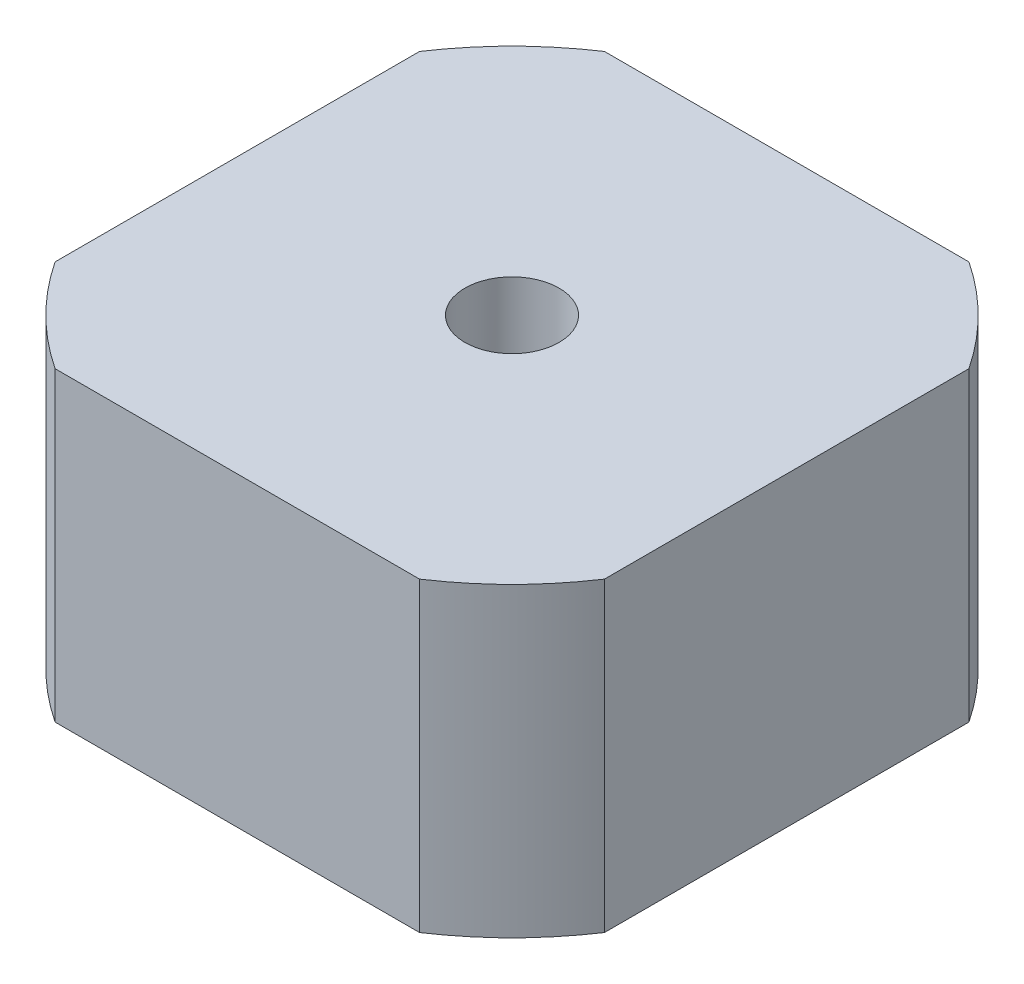
ISO-10303-21;
HEADER;
FILE_DESCRIPTION(('STEP AP214'),'2;1');
FILE_NAME('part.step','',(''),(''),'','','');
FILE_SCHEMA(('AUTOMOTIVE_DESIGN { 1 0 10303 214 1 1 1 1 }'));
ENDSEC;
DATA;
#1=APPLICATION_CONTEXT('core data for automotive mechanical design processes');
#2=APPLICATION_PROTOCOL_DEFINITION('international standard','automotive_design',2000,#1);
#3=PRODUCT_CONTEXT('',#1,'mechanical');
#4=PRODUCT('Part','Part','',(#3));
#5=PRODUCT_RELATED_PRODUCT_CATEGORY('part','',(#4));
#6=PRODUCT_DEFINITION_FORMATION('','',#4);
#7=PRODUCT_DEFINITION_CONTEXT('part definition',#1,'design');
#8=PRODUCT_DEFINITION('design','',#6,#7);
#9=PRODUCT_DEFINITION_SHAPE('','',#8);
#10=(LENGTH_UNIT() NAMED_UNIT(*) SI_UNIT(.MILLI.,.METRE.));
#11=(NAMED_UNIT(*) PLANE_ANGLE_UNIT() SI_UNIT($,.RADIAN.));
#12=(NAMED_UNIT(*) SI_UNIT($,.STERADIAN.) SOLID_ANGLE_UNIT());
#13=UNCERTAINTY_MEASURE_WITH_UNIT(LENGTH_MEASURE(1.E-05),#10,'distance_accuracy_value','');
#14=(GEOMETRIC_REPRESENTATION_CONTEXT(3) GLOBAL_UNCERTAINTY_ASSIGNED_CONTEXT((#13)) GLOBAL_UNIT_ASSIGNED_CONTEXT((#10,
#11,#12)) REPRESENTATION_CONTEXT('',''));
#15=CARTESIAN_POINT('',(0.,0.,0.));
#16=DIRECTION('',(0.,0.,1.));
#17=DIRECTION('',(1.,0.,0.));
#18=AXIS2_PLACEMENT_3D('',#15,#16,#17);
#19=CARTESIAN_POINT('',(0.,0.,0.));
#20=DIRECTION('',(0.,1.,0.));
#21=DIRECTION('',(1.,0.,0.));
#22=AXIS2_PLACEMENT_3D('',#19,#20,#21);
#23=PLANE('',#22);
#24=DIRECTION('',(0.,0.,1.));
#25=VECTOR('',#24,1.);
#26=CARTESIAN_POINT('',(-17.5,0.,-11.60818676624));
#27=LINE('',#26,#25);
#28=CARTESIAN_POINT('',(-17.5,0.,-11.60818676624));
#29=VERTEX_POINT('',#28);
#30=CARTESIAN_POINT('',(-17.5,0.,11.60818676624));
#31=VERTEX_POINT('',#30);
#32=EDGE_CURVE('E105',#29,#31,#27,.T.);
#33=ORIENTED_EDGE('',*,*,#32,.F.);
#34=CARTESIAN_POINT('',(0.,0.,0.));
#35=DIRECTION('',(0.,1.,0.));
#36=DIRECTION('',(-0.552770798392605,0.,-0.833333333333308));
#37=AXIS2_PLACEMENT_3D('',#34,#35,#36);
#38=CIRCLE('',#37,21.);
#39=CARTESIAN_POINT('',(-11.60818676624,0.,-17.5));
#40=VERTEX_POINT('',#39);
#41=EDGE_CURVE('E36',#40,#29,#38,.T.);
#42=ORIENTED_EDGE('',*,*,#41,.F.);
#43=DIRECTION('',(-1.,0.,0.));
#44=VECTOR('',#43,1.);
#45=CARTESIAN_POINT('',(11.60818676624,0.,-17.5));
#46=LINE('',#45,#44);
#47=CARTESIAN_POINT('',(11.60818676624,0.,-17.5));
#48=VERTEX_POINT('',#47);
#49=EDGE_CURVE('E128',#48,#40,#46,.T.);
#50=ORIENTED_EDGE('',*,*,#49,.F.);
#51=CARTESIAN_POINT('',(0.,0.,0.));
#52=DIRECTION('',(0.,1.,0.));
#53=DIRECTION('',(0.833333333333308,0.,-0.552770798392605));
#54=AXIS2_PLACEMENT_3D('',#51,#52,#53);
#55=CIRCLE('',#54,21.);
#56=CARTESIAN_POINT('',(17.5,0.,-11.60818676624));
#57=VERTEX_POINT('',#56);
#58=EDGE_CURVE('E112',#57,#48,#55,.T.);
#59=ORIENTED_EDGE('',*,*,#58,.F.);
#60=DIRECTION('',(0.,0.,-1.));
#61=VECTOR('',#60,1.);
#62=CARTESIAN_POINT('',(17.5,0.,11.60818676624));
#63=LINE('',#62,#61);
#64=CARTESIAN_POINT('',(17.5,0.,11.60818676624));
#65=VERTEX_POINT('',#64);
#66=EDGE_CURVE('E127',#65,#57,#63,.T.);
#67=ORIENTED_EDGE('',*,*,#66,.F.);
#68=CARTESIAN_POINT('',(0.,0.,0.));
#69=DIRECTION('',(0.,1.,0.));
#70=DIRECTION('',(0.552770798392605,0.,0.833333333333308));
#71=AXIS2_PLACEMENT_3D('',#68,#69,#70);
#72=CIRCLE('',#71,21.);
#73=CARTESIAN_POINT('',(11.60818676624,0.,17.5));
#74=VERTEX_POINT('',#73);
#75=EDGE_CURVE('E109',#74,#65,#72,.T.);
#76=ORIENTED_EDGE('',*,*,#75,.F.);
#77=DIRECTION('',(1.,0.,0.));
#78=VECTOR('',#77,1.);
#79=CARTESIAN_POINT('',(-11.60818676624,0.,17.5));
#80=LINE('',#79,#78);
#81=CARTESIAN_POINT('',(-11.60818676624,0.,17.5));
#82=VERTEX_POINT('',#81);
#83=EDGE_CURVE('E123',#82,#74,#80,.T.);
#84=ORIENTED_EDGE('',*,*,#83,.F.);
#85=CARTESIAN_POINT('',(0.,0.,0.));
#86=DIRECTION('',(0.,1.,0.));
#87=DIRECTION('',(-0.833333333333308,0.,0.552770798392605));
#88=AXIS2_PLACEMENT_3D('',#85,#86,#87);
#89=CIRCLE('',#88,21.);
#90=EDGE_CURVE('E119',#31,#82,#89,.T.);
#91=ORIENTED_EDGE('',*,*,#90,.F.);
#92=EDGE_LOOP('',(#33,#42,#50,#59,#67,#76,#84,#91));
#93=FACE_BOUND('',#92,.T.);
#94=CARTESIAN_POINT('',(0.,0.,0.));
#95=DIRECTION('',(0.,-1.,0.));
#96=DIRECTION('',(-1.,0.,0.));
#97=AXIS2_PLACEMENT_3D('',#94,#95,#96);
#98=CIRCLE('',#97,3.);
#99=CARTESIAN_POINT('',(-3.,0.,0.));
#100=VERTEX_POINT('',#99);
#101=EDGE_CURVE('E11',#100,#100,#98,.T.);
#102=ORIENTED_EDGE('',*,*,#101,.F.);
#103=EDGE_LOOP('',(#102));
#104=FACE_BOUND('',#103,.T.);
#105=ADVANCED_FACE('F17',(#93,#104),#23,.F.);
#106=CARTESIAN_POINT('',(0.,0.,0.));
#107=DIRECTION('',(0.,1.,0.));
#108=DIRECTION('',(1.,0.,0.));
#109=AXIS2_PLACEMENT_3D('',#106,#107,#108);
#110=CYLINDRICAL_SURFACE('',#109,3.);
#111=CARTESIAN_POINT('',(0.,19.5,0.));
#112=DIRECTION('',(0.,-1.,0.));
#113=DIRECTION('',(1.,0.,0.));
#114=AXIS2_PLACEMENT_3D('',#111,#112,#113);
#115=CIRCLE('',#114,3.);
#116=CARTESIAN_POINT('',(3.,19.5,0.));
#117=VERTEX_POINT('',#116);
#118=EDGE_CURVE('E97',#117,#117,#115,.T.);
#119=ORIENTED_EDGE('',*,*,#118,.F.);
#120=EDGE_LOOP('',(#119));
#121=FACE_BOUND('',#120,.T.);
#122=ORIENTED_EDGE('',*,*,#101,.T.);
#123=EDGE_LOOP('',(#122));
#124=FACE_BOUND('',#123,.T.);
#125=ADVANCED_FACE('F173',(#121,#124),#110,.F.);
#126=CARTESIAN_POINT('',(0.,19.5,0.));
#127=DIRECTION('',(0.,1.,0.));
#128=DIRECTION('',(1.,0.,0.));
#129=AXIS2_PLACEMENT_3D('',#126,#127,#128);
#130=PLANE('',#129);
#131=DIRECTION('',(1.,0.,0.));
#132=VECTOR('',#131,1.);
#133=CARTESIAN_POINT('',(-11.60818676624,19.5,17.5));
#134=LINE('',#133,#132);
#135=CARTESIAN_POINT('',(-11.60818676624,19.5,17.5));
#136=VERTEX_POINT('',#135);
#137=CARTESIAN_POINT('',(11.60818676624,19.5,17.5));
#138=VERTEX_POINT('',#137);
#139=EDGE_CURVE('E27',#136,#138,#134,.T.);
#140=ORIENTED_EDGE('',*,*,#139,.T.);
#141=CARTESIAN_POINT('',(0.,19.5,0.));
#142=DIRECTION('',(0.,1.,0.));
#143=DIRECTION('',(0.552770798392605,0.,0.833333333333308));
#144=AXIS2_PLACEMENT_3D('',#141,#142,#143);
#145=CIRCLE('',#144,21.);
#146=CARTESIAN_POINT('',(17.5,19.5,11.60818676624));
#147=VERTEX_POINT('',#146);
#148=EDGE_CURVE('E147',#138,#147,#145,.T.);
#149=ORIENTED_EDGE('',*,*,#148,.T.);
#150=DIRECTION('',(0.,0.,-1.));
#151=VECTOR('',#150,1.);
#152=CARTESIAN_POINT('',(17.5,19.5,11.60818676624));
#153=LINE('',#152,#151);
#154=CARTESIAN_POINT('',(17.5,19.5,-11.60818676624));
#155=VERTEX_POINT('',#154);
#156=EDGE_CURVE('E150',#147,#155,#153,.T.);
#157=ORIENTED_EDGE('',*,*,#156,.T.);
#158=CARTESIAN_POINT('',(0.,19.5,0.));
#159=DIRECTION('',(0.,1.,0.));
#160=DIRECTION('',(0.833333333333308,0.,-0.552770798392605));
#161=AXIS2_PLACEMENT_3D('',#158,#159,#160);
#162=CIRCLE('',#161,21.);
#163=CARTESIAN_POINT('',(11.60818676624,19.5,-17.5));
#164=VERTEX_POINT('',#163);
#165=EDGE_CURVE('E153',#155,#164,#162,.T.);
#166=ORIENTED_EDGE('',*,*,#165,.T.);
#167=DIRECTION('',(-1.,0.,0.));
#168=VECTOR('',#167,1.);
#169=CARTESIAN_POINT('',(11.60818676624,19.5,-17.5));
#170=LINE('',#169,#168);
#171=CARTESIAN_POINT('',(-11.60818676624,19.5,-17.5));
#172=VERTEX_POINT('',#171);
#173=EDGE_CURVE('E156',#164,#172,#170,.T.);
#174=ORIENTED_EDGE('',*,*,#173,.T.);
#175=CARTESIAN_POINT('',(0.,19.5,0.));
#176=DIRECTION('',(0.,1.,0.));
#177=DIRECTION('',(-0.552770798392605,0.,-0.833333333333308));
#178=AXIS2_PLACEMENT_3D('',#175,#176,#177);
#179=CIRCLE('',#178,21.);
#180=CARTESIAN_POINT('',(-17.5,19.5,-11.60818676624));
#181=VERTEX_POINT('',#180);
#182=EDGE_CURVE('E102',#172,#181,#179,.T.);
#183=ORIENTED_EDGE('',*,*,#182,.T.);
#184=DIRECTION('',(0.,0.,1.));
#185=VECTOR('',#184,1.);
#186=CARTESIAN_POINT('',(-17.5,19.5,-11.60818676624));
#187=LINE('',#186,#185);
#188=CARTESIAN_POINT('',(-17.5,19.5,11.60818676624));
#189=VERTEX_POINT('',#188);
#190=EDGE_CURVE('E82',#181,#189,#187,.T.);
#191=ORIENTED_EDGE('',*,*,#190,.T.);
#192=CARTESIAN_POINT('',(0.,19.5,0.));
#193=DIRECTION('',(0.,1.,0.));
#194=DIRECTION('',(-0.833333333333308,0.,0.552770798392605));
#195=AXIS2_PLACEMENT_3D('',#192,#193,#194);
#196=CIRCLE('',#195,21.);
#197=EDGE_CURVE('E88',#189,#136,#196,.T.);
#198=ORIENTED_EDGE('',*,*,#197,.T.);
#199=EDGE_LOOP('',(#140,#149,#157,#166,#174,#183,#191,#198));
#200=FACE_BOUND('',#199,.T.);
#201=ORIENTED_EDGE('',*,*,#118,.T.);
#202=EDGE_LOOP('',(#201));
#203=FACE_BOUND('',#202,.T.);
#204=ADVANCED_FACE('F99',(#200,#203),#130,.T.);
#205=CARTESIAN_POINT('',(0.,19.5,0.));
#206=DIRECTION('',(0.,1.,0.));
#207=DIRECTION('',(1.,0.,0.));
#208=AXIS2_PLACEMENT_3D('',#205,#206,#207);
#209=CYLINDRICAL_SURFACE('',#208,21.);
#210=DIRECTION('',(0.,1.,0.));
#211=VECTOR('',#210,1.);
#212=CARTESIAN_POINT('',(-11.60818676624,0.,17.5));
#213=LINE('',#212,#211);
#214=EDGE_CURVE('E93',#82,#136,#213,.T.);
#215=ORIENTED_EDGE('',*,*,#214,.T.);
#216=ORIENTED_EDGE('',*,*,#197,.F.);
#217=DIRECTION('',(0.,1.,0.));
#218=VECTOR('',#217,1.);
#219=CARTESIAN_POINT('',(-17.5,0.,11.60818676624));
#220=LINE('',#219,#218);
#221=EDGE_CURVE('E91',#31,#189,#220,.T.);
#222=ORIENTED_EDGE('',*,*,#221,.F.);
#223=ORIENTED_EDGE('',*,*,#90,.T.);
#224=EDGE_LOOP('',(#215,#216,#222,#223));
#225=FACE_BOUND('',#224,.T.);
#226=ADVANCED_FACE('F89',(#225),#209,.T.);
#227=CARTESIAN_POINT('',(0.,19.5,0.));
#228=DIRECTION('',(0.,1.,0.));
#229=DIRECTION('',(1.,0.,0.));
#230=AXIS2_PLACEMENT_3D('',#227,#228,#229);
#231=CYLINDRICAL_SURFACE('',#230,21.);
#232=DIRECTION('',(0.,1.,0.));
#233=VECTOR('',#232,1.);
#234=CARTESIAN_POINT('',(17.5,0.,11.60818676624));
#235=LINE('',#234,#233);
#236=EDGE_CURVE('E116',#65,#147,#235,.T.);
#237=ORIENTED_EDGE('',*,*,#236,.T.);
#238=ORIENTED_EDGE('',*,*,#148,.F.);
#239=DIRECTION('',(0.,1.,0.));
#240=VECTOR('',#239,1.);
#241=CARTESIAN_POINT('',(11.60818676624,0.,17.5));
#242=LINE('',#241,#240);
#243=EDGE_CURVE('E120',#74,#138,#242,.T.);
#244=ORIENTED_EDGE('',*,*,#243,.F.);
#245=ORIENTED_EDGE('',*,*,#75,.T.);
#246=EDGE_LOOP('',(#237,#238,#244,#245));
#247=FACE_BOUND('',#246,.T.);
#248=ADVANCED_FACE('F187',(#247),#231,.T.);
#249=CARTESIAN_POINT('',(-17.5,0.,-17.5));
#250=DIRECTION('',(-1.,0.,0.));
#251=DIRECTION('',(0.,0.,1.));
#252=AXIS2_PLACEMENT_3D('',#249,#250,#251);
#253=PLANE('',#252);
#254=ORIENTED_EDGE('',*,*,#190,.F.);
#255=DIRECTION('',(0.,1.,0.));
#256=VECTOR('',#255,1.);
#257=CARTESIAN_POINT('',(-17.5,0.,-11.60818676624));
#258=LINE('',#257,#256);
#259=EDGE_CURVE('E124',#29,#181,#258,.T.);
#260=ORIENTED_EDGE('',*,*,#259,.F.);
#261=ORIENTED_EDGE('',*,*,#32,.T.);
#262=ORIENTED_EDGE('',*,*,#221,.T.);
#263=EDGE_LOOP('',(#254,#260,#261,#262));
#264=FACE_BOUND('',#263,.T.);
#265=ADVANCED_FACE('F104',(#264),#253,.T.);
#266=CARTESIAN_POINT('',(0.,19.5,0.));
#267=DIRECTION('',(0.,1.,0.));
#268=DIRECTION('',(1.,0.,0.));
#269=AXIS2_PLACEMENT_3D('',#266,#267,#268);
#270=CYLINDRICAL_SURFACE('',#269,21.);
#271=DIRECTION('',(0.,1.,0.));
#272=VECTOR('',#271,1.);
#273=CARTESIAN_POINT('',(11.60818676624,0.,-17.5));
#274=LINE('',#273,#272);
#275=EDGE_CURVE('E107',#48,#164,#274,.T.);
#276=ORIENTED_EDGE('',*,*,#275,.T.);
#277=ORIENTED_EDGE('',*,*,#165,.F.);
#278=DIRECTION('',(0.,1.,0.));
#279=VECTOR('',#278,1.);
#280=CARTESIAN_POINT('',(17.5,0.,-11.60818676624));
#281=LINE('',#280,#279);
#282=EDGE_CURVE('E125',#57,#155,#281,.T.);
#283=ORIENTED_EDGE('',*,*,#282,.F.);
#284=ORIENTED_EDGE('',*,*,#58,.T.);
#285=EDGE_LOOP('',(#276,#277,#283,#284));
#286=FACE_BOUND('',#285,.T.);
#287=ADVANCED_FACE('F162',(#286),#270,.T.);
#288=CARTESIAN_POINT('',(0.,19.5,0.));
#289=DIRECTION('',(0.,1.,0.));
#290=DIRECTION('',(1.,0.,0.));
#291=AXIS2_PLACEMENT_3D('',#288,#289,#290);
#292=CYLINDRICAL_SURFACE('',#291,21.);
#293=ORIENTED_EDGE('',*,*,#259,.T.);
#294=ORIENTED_EDGE('',*,*,#182,.F.);
#295=DIRECTION('',(0.,1.,0.));
#296=VECTOR('',#295,1.);
#297=CARTESIAN_POINT('',(-11.60818676624,0.,-17.5));
#298=LINE('',#297,#296);
#299=EDGE_CURVE('E21',#40,#172,#298,.T.);
#300=ORIENTED_EDGE('',*,*,#299,.F.);
#301=ORIENTED_EDGE('',*,*,#41,.T.);
#302=EDGE_LOOP('',(#293,#294,#300,#301));
#303=FACE_BOUND('',#302,.T.);
#304=ADVANCED_FACE('F159',(#303),#292,.T.);
#305=CARTESIAN_POINT('',(17.5,0.,17.5));
#306=DIRECTION('',(1.,0.,0.));
#307=DIRECTION('',(0.,0.,-1.));
#308=AXIS2_PLACEMENT_3D('',#305,#306,#307);
#309=PLANE('',#308);
#310=ORIENTED_EDGE('',*,*,#66,.T.);
#311=ORIENTED_EDGE('',*,*,#282,.T.);
#312=ORIENTED_EDGE('',*,*,#156,.F.);
#313=ORIENTED_EDGE('',*,*,#236,.F.);
#314=EDGE_LOOP('',(#310,#311,#312,#313));
#315=FACE_BOUND('',#314,.T.);
#316=ADVANCED_FACE('F161',(#315),#309,.T.);
#317=CARTESIAN_POINT('',(17.5,0.,-17.5));
#318=DIRECTION('',(0.,0.,-1.));
#319=DIRECTION('',(-1.,0.,0.));
#320=AXIS2_PLACEMENT_3D('',#317,#318,#319);
#321=PLANE('',#320);
#322=ORIENTED_EDGE('',*,*,#49,.T.);
#323=ORIENTED_EDGE('',*,*,#299,.T.);
#324=ORIENTED_EDGE('',*,*,#173,.F.);
#325=ORIENTED_EDGE('',*,*,#275,.F.);
#326=EDGE_LOOP('',(#322,#323,#324,#325));
#327=FACE_BOUND('',#326,.T.);
#328=ADVANCED_FACE('F158',(#327),#321,.T.);
#329=CARTESIAN_POINT('',(-17.5,0.,17.5));
#330=DIRECTION('',(0.,0.,1.));
#331=DIRECTION('',(1.,0.,0.));
#332=AXIS2_PLACEMENT_3D('',#329,#330,#331);
#333=PLANE('',#332);
#334=ORIENTED_EDGE('',*,*,#83,.T.);
#335=ORIENTED_EDGE('',*,*,#243,.T.);
#336=ORIENTED_EDGE('',*,*,#139,.F.);
#337=ORIENTED_EDGE('',*,*,#214,.F.);
#338=EDGE_LOOP('',(#334,#335,#336,#337));
#339=FACE_BOUND('',#338,.T.);
#340=ADVANCED_FACE('F19',(#339),#333,.T.);
#341=CLOSED_SHELL('',(#105,#125,#204,#226,#248,#265,#287,#304,#316,#328,#340));
#342=MANIFOLD_SOLID_BREP('B1',#341);
#343=ADVANCED_BREP_SHAPE_REPRESENTATION('',(#18,#342),#14);
#344=SHAPE_DEFINITION_REPRESENTATION(#9,#343);
ENDSEC;
END-ISO-10303-21;
